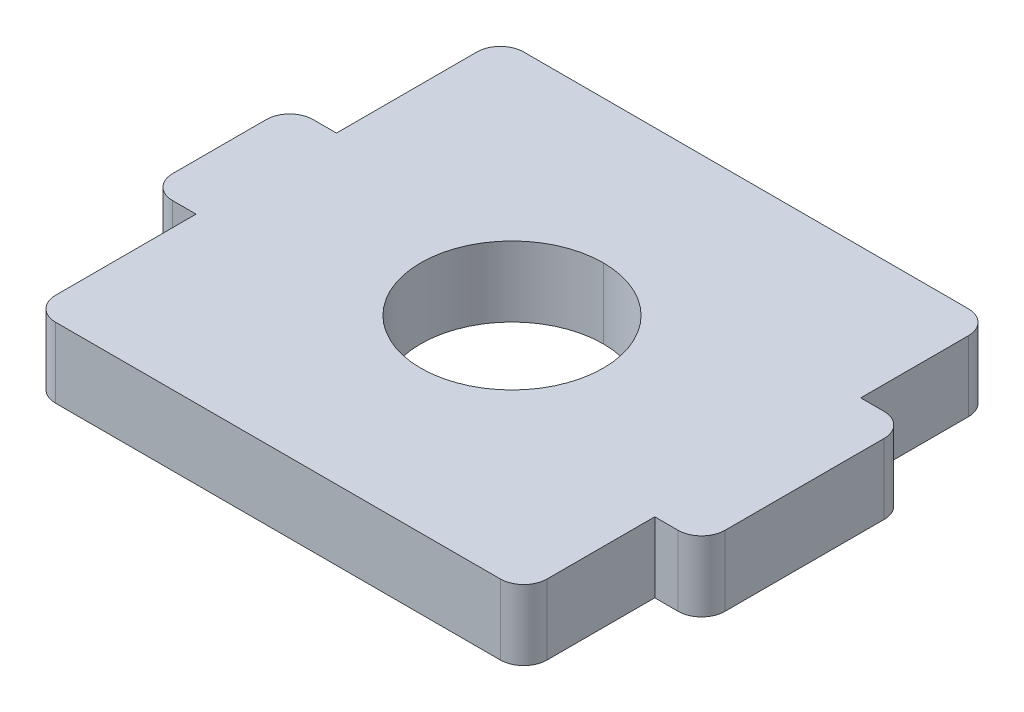
ISO-10303-21;
HEADER;
FILE_DESCRIPTION(('STEP AP214'),'2;1');
FILE_NAME('part.step','',(''),(''),'','','');
FILE_SCHEMA(('AUTOMOTIVE_DESIGN { 1 0 10303 214 1 1 1 1 }'));
ENDSEC;
DATA;
#1=APPLICATION_CONTEXT('core data for automotive mechanical design processes');
#2=APPLICATION_PROTOCOL_DEFINITION('international standard','automotive_design',2000,#1);
#3=PRODUCT_CONTEXT('',#1,'mechanical');
#4=PRODUCT('Part','Part','',(#3));
#5=PRODUCT_RELATED_PRODUCT_CATEGORY('part','',(#4));
#6=PRODUCT_DEFINITION_FORMATION('','',#4);
#7=PRODUCT_DEFINITION_CONTEXT('part definition',#1,'design');
#8=PRODUCT_DEFINITION('design','',#6,#7);
#9=PRODUCT_DEFINITION_SHAPE('','',#8);
#10=(LENGTH_UNIT() NAMED_UNIT(*) SI_UNIT(.MILLI.,.METRE.));
#11=(NAMED_UNIT(*) PLANE_ANGLE_UNIT() SI_UNIT($,.RADIAN.));
#12=(NAMED_UNIT(*) SI_UNIT($,.STERADIAN.) SOLID_ANGLE_UNIT());
#13=UNCERTAINTY_MEASURE_WITH_UNIT(LENGTH_MEASURE(1.E-05),#10,'distance_accuracy_value','');
#14=(GEOMETRIC_REPRESENTATION_CONTEXT(3) GLOBAL_UNCERTAINTY_ASSIGNED_CONTEXT((#13)) GLOBAL_UNIT_ASSIGNED_CONTEXT((#10,
#11,#12)) REPRESENTATION_CONTEXT('',''));
#15=CARTESIAN_POINT('',(0.,0.,0.));
#16=DIRECTION('',(0.,0.,1.));
#17=DIRECTION('',(1.,0.,0.));
#18=AXIS2_PLACEMENT_3D('',#15,#16,#17);
#19=CARTESIAN_POINT('',(12.5,-3.001,4.4));
#20=DIRECTION('',(0.,0.,-1.));
#21=DIRECTION('',(-1.,0.,0.));
#22=AXIS2_PLACEMENT_3D('',#19,#20,#21);
#23=PLANE('',#22);
#24=DIRECTION('',(0.,-1.,0.));
#25=VECTOR('',#24,1.);
#26=CARTESIAN_POINT('',(11.5,-3.001,4.4));
#27=LINE('',#26,#25);
#28=CARTESIAN_POINT('',(11.5,0.,4.4));
#29=VERTEX_POINT('',#28);
#30=CARTESIAN_POINT('',(11.5,-3.,4.4));
#31=VERTEX_POINT('',#30);
#32=EDGE_CURVE('E338',#29,#31,#27,.T.);
#33=ORIENTED_EDGE('',*,*,#32,.F.);
#34=DIRECTION('',(1.,0.,0.));
#35=VECTOR('',#34,1.);
#36=CARTESIAN_POINT('',(12.5,0.,4.4));
#37=LINE('',#36,#35);
#38=CARTESIAN_POINT('',(10.5,0.,4.4));
#39=VERTEX_POINT('',#38);
#40=EDGE_CURVE('E287',#39,#29,#37,.T.);
#41=ORIENTED_EDGE('',*,*,#40,.F.);
#42=DIRECTION('',(0.,-1.,0.));
#43=VECTOR('',#42,1.);
#44=CARTESIAN_POINT('',(10.5,-3.001,4.4));
#45=LINE('',#44,#43);
#46=CARTESIAN_POINT('',(10.5,-3.,4.4));
#47=VERTEX_POINT('',#46);
#48=EDGE_CURVE('E268',#39,#47,#45,.T.);
#49=ORIENTED_EDGE('',*,*,#48,.T.);
#50=DIRECTION('',(-1.,0.,0.));
#51=VECTOR('',#50,1.);
#52=CARTESIAN_POINT('',(0.,-3.,4.4));
#53=LINE('',#52,#51);
#54=EDGE_CURVE('E231',#31,#47,#53,.T.);
#55=ORIENTED_EDGE('',*,*,#54,.F.);
#56=EDGE_LOOP('',(#33,#41,#49,#55));
#57=FACE_BOUND('',#56,.T.);
#58=ADVANCED_FACE('F16',(#57),#23,.F.);
#59=CARTESIAN_POINT('',(9.5,-3.,9.));
#60=DIRECTION('',(0.,-1.,0.));
#61=DIRECTION('',(0.,0.,-1.));
#62=AXIS2_PLACEMENT_3D('',#59,#60,#61);
#63=CYLINDRICAL_SURFACE('',#62,1.);
#64=CARTESIAN_POINT('',(9.5,0.,9.));
#65=DIRECTION('',(0.,-1.,0.));
#66=DIRECTION('',(0.,0.,-1.));
#67=AXIS2_PLACEMENT_3D('',#64,#65,#66);
#68=CIRCLE('',#67,1.);
#69=CARTESIAN_POINT('',(10.5,0.,9.));
#70=VERTEX_POINT('',#69);
#71=CARTESIAN_POINT('',(9.5,0.,10.));
#72=VERTEX_POINT('',#71);
#73=EDGE_CURVE('E304',#70,#72,#68,.T.);
#74=ORIENTED_EDGE('',*,*,#73,.T.);
#75=DIRECTION('',(0.,1.,0.));
#76=VECTOR('',#75,1.);
#77=CARTESIAN_POINT('',(9.5,-3.,10.));
#78=LINE('',#77,#76);
#79=CARTESIAN_POINT('',(9.5,-3.,10.));
#80=VERTEX_POINT('',#79);
#81=EDGE_CURVE('E365',#80,#72,#78,.T.);
#82=ORIENTED_EDGE('',*,*,#81,.F.);
#83=CARTESIAN_POINT('',(9.5,-3.,9.));
#84=DIRECTION('',(0.,-1.,0.));
#85=DIRECTION('',(0.,0.,-1.));
#86=AXIS2_PLACEMENT_3D('',#83,#84,#85);
#87=CIRCLE('',#86,1.);
#88=CARTESIAN_POINT('',(10.5,-3.,9.));
#89=VERTEX_POINT('',#88);
#90=EDGE_CURVE('E402',#89,#80,#87,.T.);
#91=ORIENTED_EDGE('',*,*,#90,.F.);
#92=DIRECTION('',(0.,1.,0.));
#93=VECTOR('',#92,1.);
#94=CARTESIAN_POINT('',(10.5,-3.001,9.));
#95=LINE('',#94,#93);
#96=EDGE_CURVE('E269',#89,#70,#95,.T.);
#97=ORIENTED_EDGE('',*,*,#96,.T.);
#98=EDGE_LOOP('',(#74,#82,#91,#97));
#99=FACE_BOUND('',#98,.T.);
#100=ADVANCED_FACE('F495',(#99),#63,.T.);
#101=CARTESIAN_POINT('',(-12.5,-3.001,3.));
#102=DIRECTION('',(0.,0.,-1.));
#103=DIRECTION('',(0.,-1.,0.));
#104=AXIS2_PLACEMENT_3D('',#101,#102,#103);
#105=PLANE('',#104);
#106=DIRECTION('',(0.,1.,0.));
#107=VECTOR('',#106,1.);
#108=CARTESIAN_POINT('',(-11.5,-3.,3.));
#109=LINE('',#108,#107);
#110=CARTESIAN_POINT('',(-11.5,-3.,3.));
#111=VERTEX_POINT('',#110);
#112=CARTESIAN_POINT('',(-11.5,0.,3.));
#113=VERTEX_POINT('',#112);
#114=EDGE_CURVE('E11',#111,#113,#109,.T.);
#115=ORIENTED_EDGE('',*,*,#114,.F.);
#116=DIRECTION('',(-1.,0.,0.));
#117=VECTOR('',#116,1.);
#118=CARTESIAN_POINT('',(0.,-3.,3.));
#119=LINE('',#118,#117);
#120=CARTESIAN_POINT('',(-10.5,-3.,3.));
#121=VERTEX_POINT('',#120);
#122=EDGE_CURVE('E366',#121,#111,#119,.T.);
#123=ORIENTED_EDGE('',*,*,#122,.F.);
#124=DIRECTION('',(0.,1.,0.));
#125=VECTOR('',#124,1.);
#126=CARTESIAN_POINT('',(-10.5,-3.001,3.));
#127=LINE('',#126,#125);
#128=CARTESIAN_POINT('',(-10.5,0.,3.));
#129=VERTEX_POINT('',#128);
#130=EDGE_CURVE('E420',#121,#129,#127,.T.);
#131=ORIENTED_EDGE('',*,*,#130,.T.);
#132=DIRECTION('',(1.,0.,0.));
#133=VECTOR('',#132,1.);
#134=CARTESIAN_POINT('',(-12.5,0.,3.));
#135=LINE('',#134,#133);
#136=EDGE_CURVE('E283',#113,#129,#135,.T.);
#137=ORIENTED_EDGE('',*,*,#136,.F.);
#138=EDGE_LOOP('',(#115,#123,#131,#137));
#139=FACE_BOUND('',#138,.T.);
#140=ADVANCED_FACE('F543',(#139),#105,.F.);
#141=CARTESIAN_POINT('',(-9.5,-3.001,9.));
#142=DIRECTION('',(0.,-1.,0.));
#143=DIRECTION('',(0.,0.,-1.));
#144=AXIS2_PLACEMENT_3D('',#141,#142,#143);
#145=CYLINDRICAL_SURFACE('',#144,1.);
#146=CARTESIAN_POINT('',(-9.5,0.,9.));
#147=DIRECTION('',(0.,-1.,0.));
#148=DIRECTION('',(0.,0.,-1.));
#149=AXIS2_PLACEMENT_3D('',#146,#147,#148);
#150=CIRCLE('',#149,1.);
#151=CARTESIAN_POINT('',(-9.5,0.,10.));
#152=VERTEX_POINT('',#151);
#153=CARTESIAN_POINT('',(-10.5,0.,9.));
#154=VERTEX_POINT('',#153);
#155=EDGE_CURVE('E257',#152,#154,#150,.T.);
#156=ORIENTED_EDGE('',*,*,#155,.T.);
#157=DIRECTION('',(0.,-1.,0.));
#158=VECTOR('',#157,1.);
#159=CARTESIAN_POINT('',(-10.5,-3.001,9.));
#160=LINE('',#159,#158);
#161=CARTESIAN_POINT('',(-10.5,-3.,9.));
#162=VERTEX_POINT('',#161);
#163=EDGE_CURVE('E417',#154,#162,#160,.T.);
#164=ORIENTED_EDGE('',*,*,#163,.T.);
#165=CARTESIAN_POINT('',(-9.5,-3.,9.));
#166=DIRECTION('',(0.,-1.,0.));
#167=DIRECTION('',(0.,0.,-1.));
#168=AXIS2_PLACEMENT_3D('',#165,#166,#167);
#169=CIRCLE('',#168,1.);
#170=CARTESIAN_POINT('',(-9.5,-3.,10.));
#171=VERTEX_POINT('',#170);
#172=EDGE_CURVE('E371',#171,#162,#169,.T.);
#173=ORIENTED_EDGE('',*,*,#172,.F.);
#174=DIRECTION('',(0.,-1.,0.));
#175=VECTOR('',#174,1.);
#176=CARTESIAN_POINT('',(-9.5,-3.,10.));
#177=LINE('',#176,#175);
#178=EDGE_CURVE('E361',#152,#171,#177,.T.);
#179=ORIENTED_EDGE('',*,*,#178,.F.);
#180=EDGE_LOOP('',(#156,#164,#173,#179));
#181=FACE_BOUND('',#180,.T.);
#182=ADVANCED_FACE('F547',(#181),#145,.T.);
#183=CARTESIAN_POINT('',(-11.5,-3.001,-2.));
#184=DIRECTION('',(0.,-1.,0.));
#185=DIRECTION('',(0.,0.,-1.));
#186=AXIS2_PLACEMENT_3D('',#183,#184,#185);
#187=CYLINDRICAL_SURFACE('',#186,1.);
#188=CARTESIAN_POINT('',(-11.5,0.,-2.));
#189=DIRECTION('',(0.,-1.,0.));
#190=DIRECTION('',(0.,0.,-1.));
#191=AXIS2_PLACEMENT_3D('',#188,#189,#190);
#192=CIRCLE('',#191,1.);
#193=CARTESIAN_POINT('',(-12.5,0.,-2.));
#194=VERTEX_POINT('',#193);
#195=CARTESIAN_POINT('',(-11.5,0.,-3.));
#196=VERTEX_POINT('',#195);
#197=EDGE_CURVE('E263',#194,#196,#192,.T.);
#198=ORIENTED_EDGE('',*,*,#197,.T.);
#199=DIRECTION('',(0.,-1.,0.));
#200=VECTOR('',#199,1.);
#201=CARTESIAN_POINT('',(-11.5,-3.001,-3.));
#202=LINE('',#201,#200);
#203=CARTESIAN_POINT('',(-11.5,-3.,-3.));
#204=VERTEX_POINT('',#203);
#205=EDGE_CURVE('E27',#196,#204,#202,.T.);
#206=ORIENTED_EDGE('',*,*,#205,.T.);
#207=CARTESIAN_POINT('',(-11.5,-3.,-2.));
#208=DIRECTION('',(0.,-1.,0.));
#209=DIRECTION('',(0.,0.,-1.));
#210=AXIS2_PLACEMENT_3D('',#207,#208,#209);
#211=CIRCLE('',#210,1.);
#212=CARTESIAN_POINT('',(-12.5,-3.,-2.));
#213=VERTEX_POINT('',#212);
#214=EDGE_CURVE('E458',#213,#204,#211,.T.);
#215=ORIENTED_EDGE('',*,*,#214,.F.);
#216=DIRECTION('',(0.,-1.,0.));
#217=VECTOR('',#216,1.);
#218=CARTESIAN_POINT('',(-12.5,-3.,-2.));
#219=LINE('',#218,#217);
#220=EDGE_CURVE('E333',#194,#213,#219,.T.);
#221=ORIENTED_EDGE('',*,*,#220,.F.);
#222=EDGE_LOOP('',(#198,#206,#215,#221));
#223=FACE_BOUND('',#222,.T.);
#224=ADVANCED_FACE('F472',(#223),#187,.T.);
#225=CARTESIAN_POINT('',(-11.5,-3.,2.));
#226=DIRECTION('',(0.,-1.,0.));
#227=DIRECTION('',(0.,0.,-1.));
#228=AXIS2_PLACEMENT_3D('',#225,#226,#227);
#229=CYLINDRICAL_SURFACE('',#228,1.);
#230=CARTESIAN_POINT('',(-11.5,0.,2.));
#231=DIRECTION('',(0.,-1.,0.));
#232=DIRECTION('',(0.,0.,-1.));
#233=AXIS2_PLACEMENT_3D('',#230,#231,#232);
#234=CIRCLE('',#233,1.);
#235=CARTESIAN_POINT('',(-12.5,0.,2.));
#236=VERTEX_POINT('',#235);
#237=EDGE_CURVE('E262',#113,#236,#234,.T.);
#238=ORIENTED_EDGE('',*,*,#237,.T.);
#239=DIRECTION('',(0.,1.,0.));
#240=VECTOR('',#239,1.);
#241=CARTESIAN_POINT('',(-12.5,-3.,2.));
#242=LINE('',#241,#240);
#243=CARTESIAN_POINT('',(-12.5,-3.,2.));
#244=VERTEX_POINT('',#243);
#245=EDGE_CURVE('E331',#244,#236,#242,.T.);
#246=ORIENTED_EDGE('',*,*,#245,.F.);
#247=CARTESIAN_POINT('',(-11.5,-3.,2.));
#248=DIRECTION('',(0.,-1.,0.));
#249=DIRECTION('',(0.,0.,-1.));
#250=AXIS2_PLACEMENT_3D('',#247,#248,#249);
#251=CIRCLE('',#250,1.);
#252=EDGE_CURVE('E370',#111,#244,#251,.T.);
#253=ORIENTED_EDGE('',*,*,#252,.F.);
#254=ORIENTED_EDGE('',*,*,#114,.T.);
#255=EDGE_LOOP('',(#238,#246,#253,#254));
#256=FACE_BOUND('',#255,.T.);
#257=ADVANCED_FACE('F464',(#256),#229,.T.);
#258=CARTESIAN_POINT('',(-12.5,-3.001,-3.));
#259=DIRECTION('',(0.,0.,1.));
#260=DIRECTION('',(1.,0.,0.));
#261=AXIS2_PLACEMENT_3D('',#258,#259,#260);
#262=PLANE('',#261);
#263=ORIENTED_EDGE('',*,*,#205,.F.);
#264=DIRECTION('',(-1.,0.,0.));
#265=VECTOR('',#264,1.);
#266=CARTESIAN_POINT('',(-12.5,0.,-3.));
#267=LINE('',#266,#265);
#268=CARTESIAN_POINT('',(-10.5,0.,-3.));
#269=VERTEX_POINT('',#268);
#270=EDGE_CURVE('E278',#269,#196,#267,.T.);
#271=ORIENTED_EDGE('',*,*,#270,.F.);
#272=DIRECTION('',(0.,-1.,0.));
#273=VECTOR('',#272,1.);
#274=CARTESIAN_POINT('',(-10.5,-3.001,-3.));
#275=LINE('',#274,#273);
#276=CARTESIAN_POINT('',(-10.5,-3.,-3.));
#277=VERTEX_POINT('',#276);
#278=EDGE_CURVE('E270',#269,#277,#275,.T.);
#279=ORIENTED_EDGE('',*,*,#278,.T.);
#280=DIRECTION('',(1.,0.,0.));
#281=VECTOR('',#280,1.);
#282=CARTESIAN_POINT('',(0.,-3.,-3.));
#283=LINE('',#282,#281);
#284=EDGE_CURVE('E344',#204,#277,#283,.T.);
#285=ORIENTED_EDGE('',*,*,#284,.F.);
#286=EDGE_LOOP('',(#263,#271,#279,#285));
#287=FACE_BOUND('',#286,.T.);
#288=ADVANCED_FACE('F583',(#287),#262,.F.);
#289=CARTESIAN_POINT('',(-9.5,-3.,-9.));
#290=DIRECTION('',(0.,-1.,0.));
#291=DIRECTION('',(0.,0.,-1.));
#292=AXIS2_PLACEMENT_3D('',#289,#290,#291);
#293=CYLINDRICAL_SURFACE('',#292,1.);
#294=CARTESIAN_POINT('',(-9.5,0.,-9.));
#295=DIRECTION('',(0.,-1.,0.));
#296=DIRECTION('',(0.,0.,-1.));
#297=AXIS2_PLACEMENT_3D('',#294,#295,#296);
#298=CIRCLE('',#297,1.);
#299=CARTESIAN_POINT('',(-10.5,0.,-9.));
#300=VERTEX_POINT('',#299);
#301=CARTESIAN_POINT('',(-9.5,0.,-10.));
#302=VERTEX_POINT('',#301);
#303=EDGE_CURVE('E397',#300,#302,#298,.T.);
#304=ORIENTED_EDGE('',*,*,#303,.T.);
#305=DIRECTION('',(0.,1.,0.));
#306=VECTOR('',#305,1.);
#307=CARTESIAN_POINT('',(-9.5,-3.,-10.));
#308=LINE('',#307,#306);
#309=CARTESIAN_POINT('',(-9.5,-3.,-10.));
#310=VERTEX_POINT('',#309);
#311=EDGE_CURVE('E345',#310,#302,#308,.T.);
#312=ORIENTED_EDGE('',*,*,#311,.F.);
#313=CARTESIAN_POINT('',(-9.5,-3.,-9.));
#314=DIRECTION('',(0.,-1.,0.));
#315=DIRECTION('',(0.,0.,-1.));
#316=AXIS2_PLACEMENT_3D('',#313,#314,#315);
#317=CIRCLE('',#316,1.);
#318=CARTESIAN_POINT('',(-10.5,-3.,-9.));
#319=VERTEX_POINT('',#318);
#320=EDGE_CURVE('E323',#319,#310,#317,.T.);
#321=ORIENTED_EDGE('',*,*,#320,.F.);
#322=DIRECTION('',(0.,1.,0.));
#323=VECTOR('',#322,1.);
#324=CARTESIAN_POINT('',(-10.5,-3.001,-9.));
#325=LINE('',#324,#323);
#326=EDGE_CURVE('E348',#319,#300,#325,.T.);
#327=ORIENTED_EDGE('',*,*,#326,.T.);
#328=EDGE_LOOP('',(#304,#312,#321,#327));
#329=FACE_BOUND('',#328,.T.);
#330=ADVANCED_FACE('F556',(#329),#293,.T.);
#331=CARTESIAN_POINT('',(12.5,-3.001,-4.4));
#332=DIRECTION('',(0.,0.,1.));
#333=DIRECTION('',(1.,0.,0.));
#334=AXIS2_PLACEMENT_3D('',#331,#332,#333);
#335=PLANE('',#334);
#336=DIRECTION('',(0.,1.,0.));
#337=VECTOR('',#336,1.);
#338=CARTESIAN_POINT('',(11.5,-3.,-4.4));
#339=LINE('',#338,#337);
#340=CARTESIAN_POINT('',(11.5,-3.,-4.4));
#341=VERTEX_POINT('',#340);
#342=CARTESIAN_POINT('',(11.5,0.,-4.4));
#343=VERTEX_POINT('',#342);
#344=EDGE_CURVE('E104',#341,#343,#339,.T.);
#345=ORIENTED_EDGE('',*,*,#344,.F.);
#346=DIRECTION('',(1.,0.,0.));
#347=VECTOR('',#346,1.);
#348=CARTESIAN_POINT('',(0.,-3.,-4.4));
#349=LINE('',#348,#347);
#350=CARTESIAN_POINT('',(10.5,-3.,-4.4));
#351=VERTEX_POINT('',#350);
#352=EDGE_CURVE('E20',#351,#341,#349,.T.);
#353=ORIENTED_EDGE('',*,*,#352,.F.);
#354=DIRECTION('',(0.,1.,0.));
#355=VECTOR('',#354,1.);
#356=CARTESIAN_POINT('',(10.5,-3.001,-4.4));
#357=LINE('',#356,#355);
#358=CARTESIAN_POINT('',(10.5,0.,-4.4));
#359=VERTEX_POINT('',#358);
#360=EDGE_CURVE('E227',#351,#359,#357,.T.);
#361=ORIENTED_EDGE('',*,*,#360,.T.);
#362=DIRECTION('',(-1.,0.,0.));
#363=VECTOR('',#362,1.);
#364=CARTESIAN_POINT('',(12.5,0.,-4.4));
#365=LINE('',#364,#363);
#366=EDGE_CURVE('E357',#343,#359,#365,.T.);
#367=ORIENTED_EDGE('',*,*,#366,.F.);
#368=EDGE_LOOP('',(#345,#353,#361,#367));
#369=FACE_BOUND('',#368,.T.);
#370=ADVANCED_FACE('F225',(#369),#335,.F.);
#371=CARTESIAN_POINT('',(9.5,-3.001,-9.));
#372=DIRECTION('',(0.,-1.,0.));
#373=DIRECTION('',(0.,0.,-1.));
#374=AXIS2_PLACEMENT_3D('',#371,#372,#373);
#375=CYLINDRICAL_SURFACE('',#374,1.);
#376=CARTESIAN_POINT('',(9.5,0.,-9.));
#377=DIRECTION('',(0.,-1.,0.));
#378=DIRECTION('',(0.,0.,-1.));
#379=AXIS2_PLACEMENT_3D('',#376,#377,#378);
#380=CIRCLE('',#379,1.);
#381=CARTESIAN_POINT('',(9.5,0.,-10.));
#382=VERTEX_POINT('',#381);
#383=CARTESIAN_POINT('',(10.5,0.,-9.));
#384=VERTEX_POINT('',#383);
#385=EDGE_CURVE('E320',#382,#384,#380,.T.);
#386=ORIENTED_EDGE('',*,*,#385,.T.);
#387=DIRECTION('',(0.,-1.,0.));
#388=VECTOR('',#387,1.);
#389=CARTESIAN_POINT('',(10.5,-3.001,-9.));
#390=LINE('',#389,#388);
#391=CARTESIAN_POINT('',(10.5,-3.,-9.));
#392=VERTEX_POINT('',#391);
#393=EDGE_CURVE('E247',#384,#392,#390,.T.);
#394=ORIENTED_EDGE('',*,*,#393,.T.);
#395=CARTESIAN_POINT('',(9.5,-3.,-9.));
#396=DIRECTION('',(0.,-1.,0.));
#397=DIRECTION('',(0.,0.,-1.));
#398=AXIS2_PLACEMENT_3D('',#395,#396,#397);
#399=CIRCLE('',#398,1.);
#400=CARTESIAN_POINT('',(9.5,-3.,-10.));
#401=VERTEX_POINT('',#400);
#402=EDGE_CURVE('E232',#401,#392,#399,.T.);
#403=ORIENTED_EDGE('',*,*,#402,.F.);
#404=DIRECTION('',(0.,-1.,0.));
#405=VECTOR('',#404,1.);
#406=CARTESIAN_POINT('',(9.5,-3.,-10.));
#407=LINE('',#406,#405);
#408=EDGE_CURVE('E240',#382,#401,#407,.T.);
#409=ORIENTED_EDGE('',*,*,#408,.F.);
#410=EDGE_LOOP('',(#386,#394,#403,#409));
#411=FACE_BOUND('',#410,.T.);
#412=ADVANCED_FACE('F18',(#411),#375,.T.);
#413=CARTESIAN_POINT('',(0.,-3.,0.));
#414=DIRECTION('',(0.,-1.,0.));
#415=DIRECTION('',(0.,0.,-1.));
#416=AXIS2_PLACEMENT_3D('',#413,#414,#415);
#417=PLANE('',#416);
#418=CARTESIAN_POINT('',(0.,-3.,0.));
#419=DIRECTION('',(0.,1.,0.));
#420=DIRECTION('',(0.,0.,1.));
#421=AXIS2_PLACEMENT_3D('',#418,#419,#420);
#422=CIRCLE('',#421,3.9);
#423=CARTESIAN_POINT('',(0.,-3.,3.9));
#424=VERTEX_POINT('',#423);
#425=CARTESIAN_POINT('',(0.,-3.,-3.9));
#426=VERTEX_POINT('',#425);
#427=EDGE_CURVE('E335',#424,#426,#422,.T.);
#428=ORIENTED_EDGE('',*,*,#427,.T.);
#429=CARTESIAN_POINT('',(0.,-3.,0.));
#430=DIRECTION('',(0.,1.,0.));
#431=DIRECTION('',(0.,0.,1.));
#432=AXIS2_PLACEMENT_3D('',#429,#430,#431);
#433=CIRCLE('',#432,3.9);
#434=EDGE_CURVE('E382',#426,#424,#433,.T.);
#435=ORIENTED_EDGE('',*,*,#434,.T.);
#436=EDGE_LOOP('',(#428,#435));
#437=FACE_BOUND('',#436,.T.);
#438=ORIENTED_EDGE('',*,*,#402,.T.);
#439=DIRECTION('',(0.,0.,1.));
#440=VECTOR('',#439,1.);
#441=CARTESIAN_POINT('',(10.5,-3.,-10.));
#442=LINE('',#441,#440);
#443=EDGE_CURVE('E234',#392,#351,#442,.T.);
#444=ORIENTED_EDGE('',*,*,#443,.T.);
#445=ORIENTED_EDGE('',*,*,#352,.T.);
#446=CARTESIAN_POINT('',(11.5,-3.,-3.4));
#447=DIRECTION('',(0.,1.,0.));
#448=DIRECTION('',(0.,0.,-1.));
#449=AXIS2_PLACEMENT_3D('',#446,#447,#448);
#450=CIRCLE('',#449,1.);
#451=CARTESIAN_POINT('',(12.5,-3.,-3.4));
#452=VERTEX_POINT('',#451);
#453=EDGE_CURVE('E341',#452,#341,#450,.T.);
#454=ORIENTED_EDGE('',*,*,#453,.F.);
#455=DIRECTION('',(0.,0.,-1.));
#456=VECTOR('',#455,1.);
#457=CARTESIAN_POINT('',(12.5,-3.,10.));
#458=LINE('',#457,#456);
#459=CARTESIAN_POINT('',(12.5,-3.,3.4));
#460=VERTEX_POINT('',#459);
#461=EDGE_CURVE('E284',#460,#452,#458,.T.);
#462=ORIENTED_EDGE('',*,*,#461,.F.);
#463=CARTESIAN_POINT('',(11.5,-3.,3.4));
#464=DIRECTION('',(0.,1.,0.));
#465=DIRECTION('',(0.,0.,-1.));
#466=AXIS2_PLACEMENT_3D('',#463,#464,#465);
#467=CIRCLE('',#466,1.);
#468=EDGE_CURVE('E381',#31,#460,#467,.T.);
#469=ORIENTED_EDGE('',*,*,#468,.F.);
#470=ORIENTED_EDGE('',*,*,#54,.T.);
#471=DIRECTION('',(0.,0.,1.));
#472=VECTOR('',#471,1.);
#473=CARTESIAN_POINT('',(10.5,-3.,10.));
#474=LINE('',#473,#472);
#475=EDGE_CURVE('E264',#47,#89,#474,.T.);
#476=ORIENTED_EDGE('',*,*,#475,.T.);
#477=ORIENTED_EDGE('',*,*,#90,.T.);
#478=DIRECTION('',(1.,0.,0.));
#479=VECTOR('',#478,1.);
#480=CARTESIAN_POINT('',(-12.5,-3.,10.));
#481=LINE('',#480,#479);
#482=EDGE_CURVE('E389',#171,#80,#481,.T.);
#483=ORIENTED_EDGE('',*,*,#482,.F.);
#484=ORIENTED_EDGE('',*,*,#172,.T.);
#485=DIRECTION('',(0.,0.,-1.));
#486=VECTOR('',#485,1.);
#487=CARTESIAN_POINT('',(-10.5,-3.,10.));
#488=LINE('',#487,#486);
#489=EDGE_CURVE('E392',#162,#121,#488,.T.);
#490=ORIENTED_EDGE('',*,*,#489,.T.);
#491=ORIENTED_EDGE('',*,*,#122,.T.);
#492=ORIENTED_EDGE('',*,*,#252,.T.);
#493=DIRECTION('',(0.,0.,1.));
#494=VECTOR('',#493,1.);
#495=CARTESIAN_POINT('',(-12.5,-3.,10.));
#496=LINE('',#495,#494);
#497=EDGE_CURVE('E274',#213,#244,#496,.T.);
#498=ORIENTED_EDGE('',*,*,#497,.F.);
#499=ORIENTED_EDGE('',*,*,#214,.T.);
#500=ORIENTED_EDGE('',*,*,#284,.T.);
#501=DIRECTION('',(0.,0.,-1.));
#502=VECTOR('',#501,1.);
#503=CARTESIAN_POINT('',(-10.5,-3.,-10.));
#504=LINE('',#503,#502);
#505=EDGE_CURVE('E275',#277,#319,#504,.T.);
#506=ORIENTED_EDGE('',*,*,#505,.T.);
#507=ORIENTED_EDGE('',*,*,#320,.T.);
#508=DIRECTION('',(-1.,0.,0.));
#509=VECTOR('',#508,1.);
#510=CARTESIAN_POINT('',(-12.5,-3.,-10.));
#511=LINE('',#510,#509);
#512=EDGE_CURVE('E349',#401,#310,#511,.T.);
#513=ORIENTED_EDGE('',*,*,#512,.F.);
#514=EDGE_LOOP('',(#438,#444,#445,#454,#462,#469,#470,#476,#477,#483,#484,#490,#491,#492,#498,
#499,#500,#506,#507,#513));
#515=FACE_BOUND('',#514,.T.);
#516=ADVANCED_FACE('F235',(#437,#515),#417,.T.);
#517=CARTESIAN_POINT('',(11.5,-3.,-3.4));
#518=DIRECTION('',(0.,-1.,0.));
#519=DIRECTION('',(0.,0.,-1.));
#520=AXIS2_PLACEMENT_3D('',#517,#518,#519);
#521=CYLINDRICAL_SURFACE('',#520,1.);
#522=CARTESIAN_POINT('',(11.5,0.,-3.4));
#523=DIRECTION('',(0.,-1.,0.));
#524=DIRECTION('',(0.,0.,-1.));
#525=AXIS2_PLACEMENT_3D('',#522,#523,#524);
#526=CIRCLE('',#525,1.);
#527=CARTESIAN_POINT('',(12.5,0.,-3.4));
#528=VERTEX_POINT('',#527);
#529=EDGE_CURVE('E354',#343,#528,#526,.T.);
#530=ORIENTED_EDGE('',*,*,#529,.T.);
#531=DIRECTION('',(0.,1.,0.));
#532=VECTOR('',#531,1.);
#533=CARTESIAN_POINT('',(12.5,-3.,-3.4));
#534=LINE('',#533,#532);
#535=EDGE_CURVE('E87',#452,#528,#534,.T.);
#536=ORIENTED_EDGE('',*,*,#535,.F.);
#537=ORIENTED_EDGE('',*,*,#453,.T.);
#538=ORIENTED_EDGE('',*,*,#344,.T.);
#539=EDGE_LOOP('',(#530,#536,#537,#538));
#540=FACE_BOUND('',#539,.T.);
#541=ADVANCED_FACE('F534',(#540),#521,.T.);
#542=CARTESIAN_POINT('',(11.5,-3.001,3.4));
#543=DIRECTION('',(0.,-1.,0.));
#544=DIRECTION('',(0.,0.,-1.));
#545=AXIS2_PLACEMENT_3D('',#542,#543,#544);
#546=CYLINDRICAL_SURFACE('',#545,1.);
#547=CARTESIAN_POINT('',(11.5,0.,3.4));
#548=DIRECTION('',(0.,-1.,0.));
#549=DIRECTION('',(0.,0.,-1.));
#550=AXIS2_PLACEMENT_3D('',#547,#548,#549);
#551=CIRCLE('',#550,1.);
#552=CARTESIAN_POINT('',(12.5,0.,3.4));
#553=VERTEX_POINT('',#552);
#554=EDGE_CURVE('E290',#553,#29,#551,.T.);
#555=ORIENTED_EDGE('',*,*,#554,.T.);
#556=ORIENTED_EDGE('',*,*,#32,.T.);
#557=ORIENTED_EDGE('',*,*,#468,.T.);
#558=DIRECTION('',(0.,-1.,0.));
#559=VECTOR('',#558,1.);
#560=CARTESIAN_POINT('',(12.5,-3.,3.4));
#561=LINE('',#560,#559);
#562=EDGE_CURVE('E286',#553,#460,#561,.T.);
#563=ORIENTED_EDGE('',*,*,#562,.F.);
#564=EDGE_LOOP('',(#555,#556,#557,#563));
#565=FACE_BOUND('',#564,.T.);
#566=ADVANCED_FACE('F538',(#565),#546,.T.);
#567=CARTESIAN_POINT('',(0.,-10.,0.));
#568=DIRECTION('',(0.,1.,0.));
#569=DIRECTION('',(0.,0.,1.));
#570=AXIS2_PLACEMENT_3D('',#567,#568,#569);
#571=CYLINDRICAL_SURFACE('',#570,3.9);
#572=DIRECTION('',(0.,1.,0.));
#573=VECTOR('',#572,1.);
#574=CARTESIAN_POINT('',(0.,-10.,-3.9));
#575=LINE('',#574,#573);
#576=CARTESIAN_POINT('',(0.,0.,-3.9));
#577=VERTEX_POINT('',#576);
#578=EDGE_CURVE('E386',#426,#577,#575,.T.);
#579=ORIENTED_EDGE('',*,*,#578,.F.);
#580=ORIENTED_EDGE('',*,*,#427,.F.);
#581=DIRECTION('',(0.,1.,0.));
#582=VECTOR('',#581,1.);
#583=CARTESIAN_POINT('',(0.,-10.,3.9));
#584=LINE('',#583,#582);
#585=CARTESIAN_POINT('',(0.,0.,3.9));
#586=VERTEX_POINT('',#585);
#587=EDGE_CURVE('E358',#424,#586,#584,.T.);
#588=ORIENTED_EDGE('',*,*,#587,.T.);
#589=CARTESIAN_POINT('',(0.,0.,0.));
#590=DIRECTION('',(0.,1.,0.));
#591=DIRECTION('',(0.,0.,1.));
#592=AXIS2_PLACEMENT_3D('',#589,#590,#591);
#593=CIRCLE('',#592,3.9);
#594=EDGE_CURVE('E353',#586,#577,#593,.T.);
#595=ORIENTED_EDGE('',*,*,#594,.T.);
#596=EDGE_LOOP('',(#579,#580,#588,#595));
#597=FACE_BOUND('',#596,.T.);
#598=ADVANCED_FACE('F575',(#597),#571,.F.);
#599=CARTESIAN_POINT('',(10.5,-3.001,10.));
#600=DIRECTION('',(-1.,0.,0.));
#601=DIRECTION('',(0.,0.,1.));
#602=AXIS2_PLACEMENT_3D('',#599,#600,#601);
#603=PLANE('',#602);
#604=ORIENTED_EDGE('',*,*,#96,.F.);
#605=ORIENTED_EDGE('',*,*,#475,.F.);
#606=ORIENTED_EDGE('',*,*,#48,.F.);
#607=DIRECTION('',(0.,0.,1.));
#608=VECTOR('',#607,1.);
#609=CARTESIAN_POINT('',(10.5,0.,0.));
#610=LINE('',#609,#608);
#611=EDGE_CURVE('E291',#39,#70,#610,.T.);
#612=ORIENTED_EDGE('',*,*,#611,.T.);
#613=EDGE_LOOP('',(#604,#605,#606,#612));
#614=FACE_BOUND('',#613,.T.);
#615=ADVANCED_FACE('F571',(#614),#603,.F.);
#616=CARTESIAN_POINT('',(-12.5,-3.,10.));
#617=DIRECTION('',(0.,0.,1.));
#618=DIRECTION('',(1.,0.,0.));
#619=AXIS2_PLACEMENT_3D('',#616,#617,#618);
#620=PLANE('',#619);
#621=ORIENTED_EDGE('',*,*,#482,.T.);
#622=ORIENTED_EDGE('',*,*,#81,.T.);
#623=DIRECTION('',(-1.,0.,0.));
#624=VECTOR('',#623,1.);
#625=CARTESIAN_POINT('',(0.,0.,10.));
#626=LINE('',#625,#624);
#627=EDGE_CURVE('E316',#72,#152,#626,.T.);
#628=ORIENTED_EDGE('',*,*,#627,.T.);
#629=ORIENTED_EDGE('',*,*,#178,.T.);
#630=EDGE_LOOP('',(#621,#622,#628,#629));
#631=FACE_BOUND('',#630,.T.);
#632=ADVANCED_FACE('F490',(#631),#620,.T.);
#633=CARTESIAN_POINT('',(-10.5,-3.001,10.));
#634=DIRECTION('',(1.,0.,0.));
#635=DIRECTION('',(0.,1.,0.));
#636=AXIS2_PLACEMENT_3D('',#633,#634,#635);
#637=PLANE('',#636);
#638=ORIENTED_EDGE('',*,*,#163,.F.);
#639=DIRECTION('',(0.,0.,-1.));
#640=VECTOR('',#639,1.);
#641=CARTESIAN_POINT('',(-10.5,0.,0.));
#642=LINE('',#641,#640);
#643=EDGE_CURVE('E279',#154,#129,#642,.T.);
#644=ORIENTED_EDGE('',*,*,#643,.T.);
#645=ORIENTED_EDGE('',*,*,#130,.F.);
#646=ORIENTED_EDGE('',*,*,#489,.F.);
#647=EDGE_LOOP('',(#638,#644,#645,#646));
#648=FACE_BOUND('',#647,.T.);
#649=ADVANCED_FACE('F628',(#648),#637,.F.);
#650=CARTESIAN_POINT('',(-12.5,-3.,10.));
#651=DIRECTION('',(-1.,0.,0.));
#652=DIRECTION('',(0.,0.,1.));
#653=AXIS2_PLACEMENT_3D('',#650,#651,#652);
#654=PLANE('',#653);
#655=ORIENTED_EDGE('',*,*,#497,.T.);
#656=ORIENTED_EDGE('',*,*,#245,.T.);
#657=DIRECTION('',(0.,0.,-1.));
#658=VECTOR('',#657,1.);
#659=CARTESIAN_POINT('',(-12.5,0.,0.));
#660=LINE('',#659,#658);
#661=EDGE_CURVE('E259',#236,#194,#660,.T.);
#662=ORIENTED_EDGE('',*,*,#661,.T.);
#663=ORIENTED_EDGE('',*,*,#220,.T.);
#664=EDGE_LOOP('',(#655,#656,#662,#663));
#665=FACE_BOUND('',#664,.T.);
#666=ADVANCED_FACE('F455',(#665),#654,.T.);
#667=CARTESIAN_POINT('',(-10.5,-3.001,-10.));
#668=DIRECTION('',(1.,0.,0.));
#669=DIRECTION('',(0.,0.,-1.));
#670=AXIS2_PLACEMENT_3D('',#667,#668,#669);
#671=PLANE('',#670);
#672=ORIENTED_EDGE('',*,*,#326,.F.);
#673=ORIENTED_EDGE('',*,*,#505,.F.);
#674=ORIENTED_EDGE('',*,*,#278,.F.);
#675=DIRECTION('',(0.,0.,-1.));
#676=VECTOR('',#675,1.);
#677=CARTESIAN_POINT('',(-10.5,0.,0.));
#678=LINE('',#677,#676);
#679=EDGE_CURVE('E327',#269,#300,#678,.T.);
#680=ORIENTED_EDGE('',*,*,#679,.T.);
#681=EDGE_LOOP('',(#672,#673,#674,#680));
#682=FACE_BOUND('',#681,.T.);
#683=ADVANCED_FACE('F600',(#682),#671,.F.);
#684=CARTESIAN_POINT('',(-12.5,-3.,-10.));
#685=DIRECTION('',(0.,0.,-1.));
#686=DIRECTION('',(0.,-1.,0.));
#687=AXIS2_PLACEMENT_3D('',#684,#685,#686);
#688=PLANE('',#687);
#689=DIRECTION('',(1.,0.,0.));
#690=VECTOR('',#689,1.);
#691=CARTESIAN_POINT('',(0.,0.,-10.));
#692=LINE('',#691,#690);
#693=EDGE_CURVE('E416',#302,#382,#692,.T.);
#694=ORIENTED_EDGE('',*,*,#693,.T.);
#695=ORIENTED_EDGE('',*,*,#408,.T.);
#696=ORIENTED_EDGE('',*,*,#512,.T.);
#697=ORIENTED_EDGE('',*,*,#311,.T.);
#698=EDGE_LOOP('',(#694,#695,#696,#697));
#699=FACE_BOUND('',#698,.T.);
#700=ADVANCED_FACE('F596',(#699),#688,.T.);
#701=CARTESIAN_POINT('',(10.5,-3.001,-10.));
#702=DIRECTION('',(-1.,0.,0.));
#703=DIRECTION('',(0.,0.,1.));
#704=AXIS2_PLACEMENT_3D('',#701,#702,#703);
#705=PLANE('',#704);
#706=ORIENTED_EDGE('',*,*,#393,.F.);
#707=DIRECTION('',(0.,0.,1.));
#708=VECTOR('',#707,1.);
#709=CARTESIAN_POINT('',(10.5,0.,0.));
#710=LINE('',#709,#708);
#711=EDGE_CURVE('E244',#384,#359,#710,.T.);
#712=ORIENTED_EDGE('',*,*,#711,.T.);
#713=ORIENTED_EDGE('',*,*,#360,.F.);
#714=ORIENTED_EDGE('',*,*,#443,.F.);
#715=EDGE_LOOP('',(#706,#712,#713,#714));
#716=FACE_BOUND('',#715,.T.);
#717=ADVANCED_FACE('F242',(#716),#705,.F.);
#718=CARTESIAN_POINT('',(12.5,-3.,10.));
#719=DIRECTION('',(1.,0.,0.));
#720=DIRECTION('',(0.,1.,0.));
#721=AXIS2_PLACEMENT_3D('',#718,#719,#720);
#722=PLANE('',#721);
#723=DIRECTION('',(0.,0.,1.));
#724=VECTOR('',#723,1.);
#725=CARTESIAN_POINT('',(12.5,0.,0.));
#726=LINE('',#725,#724);
#727=EDGE_CURVE('E300',#528,#553,#726,.T.);
#728=ORIENTED_EDGE('',*,*,#727,.T.);
#729=ORIENTED_EDGE('',*,*,#562,.T.);
#730=ORIENTED_EDGE('',*,*,#461,.T.);
#731=ORIENTED_EDGE('',*,*,#535,.T.);
#732=EDGE_LOOP('',(#728,#729,#730,#731));
#733=FACE_BOUND('',#732,.T.);
#734=ADVANCED_FACE('F565',(#733),#722,.T.);
#735=CARTESIAN_POINT('',(0.,0.,0.));
#736=DIRECTION('',(0.,-1.,0.));
#737=DIRECTION('',(0.,0.,-1.));
#738=AXIS2_PLACEMENT_3D('',#735,#736,#737);
#739=PLANE('',#738);
#740=ORIENTED_EDGE('',*,*,#594,.F.);
#741=CARTESIAN_POINT('',(0.,0.,0.));
#742=DIRECTION('',(0.,1.,0.));
#743=DIRECTION('',(0.,0.,1.));
#744=AXIS2_PLACEMENT_3D('',#741,#742,#743);
#745=CIRCLE('',#744,3.9);
#746=EDGE_CURVE('E444',#577,#586,#745,.T.);
#747=ORIENTED_EDGE('',*,*,#746,.F.);
#748=EDGE_LOOP('',(#740,#747));
#749=FACE_BOUND('',#748,.T.);
#750=ORIENTED_EDGE('',*,*,#529,.F.);
#751=ORIENTED_EDGE('',*,*,#366,.T.);
#752=ORIENTED_EDGE('',*,*,#711,.F.);
#753=ORIENTED_EDGE('',*,*,#385,.F.);
#754=ORIENTED_EDGE('',*,*,#693,.F.);
#755=ORIENTED_EDGE('',*,*,#303,.F.);
#756=ORIENTED_EDGE('',*,*,#679,.F.);
#757=ORIENTED_EDGE('',*,*,#270,.T.);
#758=ORIENTED_EDGE('',*,*,#197,.F.);
#759=ORIENTED_EDGE('',*,*,#661,.F.);
#760=ORIENTED_EDGE('',*,*,#237,.F.);
#761=ORIENTED_EDGE('',*,*,#136,.T.);
#762=ORIENTED_EDGE('',*,*,#643,.F.);
#763=ORIENTED_EDGE('',*,*,#155,.F.);
#764=ORIENTED_EDGE('',*,*,#627,.F.);
#765=ORIENTED_EDGE('',*,*,#73,.F.);
#766=ORIENTED_EDGE('',*,*,#611,.F.);
#767=ORIENTED_EDGE('',*,*,#40,.T.);
#768=ORIENTED_EDGE('',*,*,#554,.F.);
#769=ORIENTED_EDGE('',*,*,#727,.F.);
#770=EDGE_LOOP('',(#750,#751,#752,#753,#754,#755,#756,#757,#758,#759,#760,#761,#762,#763,#764,
#765,#766,#767,#768,#769));
#771=FACE_BOUND('',#770,.T.);
#772=ADVANCED_FACE('F469',(#749,#771),#739,.F.);
#773=CARTESIAN_POINT('',(0.,-10.,0.));
#774=DIRECTION('',(0.,1.,0.));
#775=DIRECTION('',(0.,0.,1.));
#776=AXIS2_PLACEMENT_3D('',#773,#774,#775);
#777=CYLINDRICAL_SURFACE('',#776,3.9);
#778=ORIENTED_EDGE('',*,*,#434,.F.);
#779=ORIENTED_EDGE('',*,*,#578,.T.);
#780=ORIENTED_EDGE('',*,*,#746,.T.);
#781=ORIENTED_EDGE('',*,*,#587,.F.);
#782=EDGE_LOOP('',(#778,#779,#780,#781));
#783=FACE_BOUND('',#782,.T.);
#784=ADVANCED_FACE('F564',(#783),#777,.F.);
#785=CLOSED_SHELL('',(#58,#100,#140,#182,#224,#257,#288,#330,#370,#412,#516,#541,#566,#598,#615,
#632,#649,#666,#683,#700,#717,#734,#772,#784));
#786=MANIFOLD_SOLID_BREP('B1',#785);
#787=ADVANCED_BREP_SHAPE_REPRESENTATION('',(#18,#786),#14);
#788=SHAPE_DEFINITION_REPRESENTATION(#9,#787);
ENDSEC;
END-ISO-10303-21;
